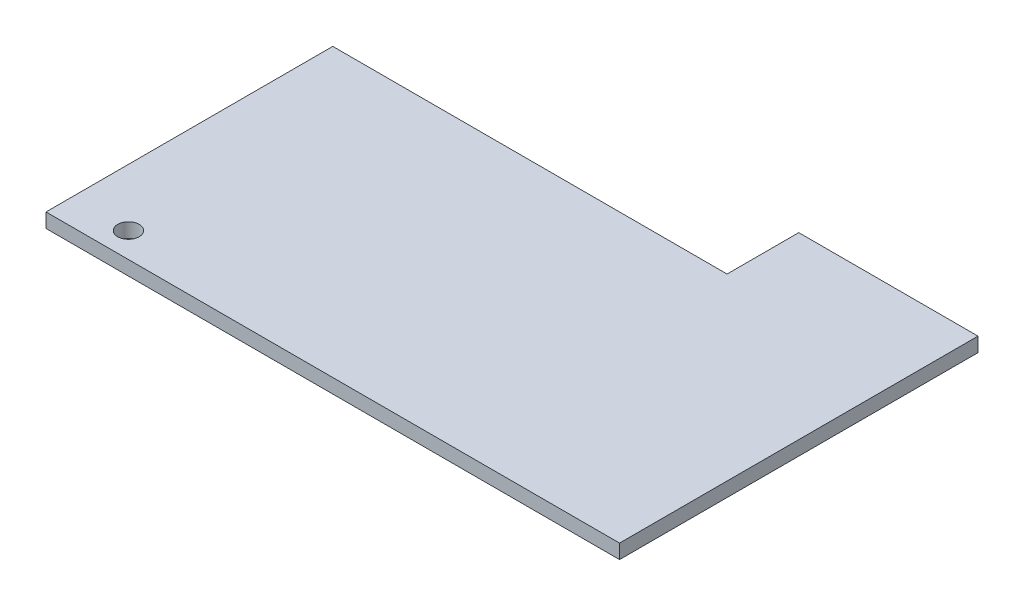
ISO-10303-21;
HEADER;
FILE_DESCRIPTION(('STEP AP214'),'2;1');
FILE_NAME('part.step','',(''),(''),'','','');
FILE_SCHEMA(('AUTOMOTIVE_DESIGN { 1 0 10303 214 1 1 1 1 }'));
ENDSEC;
DATA;
#1=APPLICATION_CONTEXT('core data for automotive mechanical design processes');
#2=APPLICATION_PROTOCOL_DEFINITION('international standard','automotive_design',2000,#1);
#3=PRODUCT_CONTEXT('',#1,'mechanical');
#4=PRODUCT('Part','Part','',(#3));
#5=PRODUCT_RELATED_PRODUCT_CATEGORY('part','',(#4));
#6=PRODUCT_DEFINITION_FORMATION('','',#4);
#7=PRODUCT_DEFINITION_CONTEXT('part definition',#1,'design');
#8=PRODUCT_DEFINITION('design','',#6,#7);
#9=PRODUCT_DEFINITION_SHAPE('','',#8);
#10=(LENGTH_UNIT() NAMED_UNIT(*) SI_UNIT(.MILLI.,.METRE.));
#11=(NAMED_UNIT(*) PLANE_ANGLE_UNIT() SI_UNIT($,.RADIAN.));
#12=(NAMED_UNIT(*) SI_UNIT($,.STERADIAN.) SOLID_ANGLE_UNIT());
#13=UNCERTAINTY_MEASURE_WITH_UNIT(LENGTH_MEASURE(1.E-05),#10,'distance_accuracy_value','');
#14=(GEOMETRIC_REPRESENTATION_CONTEXT(3) GLOBAL_UNCERTAINTY_ASSIGNED_CONTEXT((#13)) GLOBAL_UNIT_ASSIGNED_CONTEXT((#10,
#11,#12)) REPRESENTATION_CONTEXT('',''));
#15=CARTESIAN_POINT('',(0.,0.,0.));
#16=DIRECTION('',(0.,0.,1.));
#17=DIRECTION('',(1.,0.,0.));
#18=AXIS2_PLACEMENT_3D('',#15,#16,#17);
#19=CARTESIAN_POINT('',(0.,2.,0.));
#20=DIRECTION('',(1.,0.,0.));
#21=DIRECTION('',(0.,0.,-1.));
#22=AXIS2_PLACEMENT_3D('',#19,#20,#21);
#23=PLANE('',#22);
#24=DIRECTION('',(0.,0.,1.));
#25=VECTOR('',#24,1.);
#26=CARTESIAN_POINT('',(0.,2.,0.));
#27=LINE('',#26,#25);
#28=CARTESIAN_POINT('',(0.,2.,-40.));
#29=VERTEX_POINT('',#28);
#30=CARTESIAN_POINT('',(0.,2.,0.));
#31=VERTEX_POINT('',#30);
#32=EDGE_CURVE('E78',#29,#31,#27,.T.);
#33=ORIENTED_EDGE('',*,*,#32,.F.);
#34=DIRECTION('',(0.,1.,0.));
#35=VECTOR('',#34,1.);
#36=CARTESIAN_POINT('',(0.,0.,-40.));
#37=LINE('',#36,#35);
#38=CARTESIAN_POINT('',(0.,0.,-40.));
#39=VERTEX_POINT('',#38);
#40=EDGE_CURVE('E98',#39,#29,#37,.T.);
#41=ORIENTED_EDGE('',*,*,#40,.F.);
#42=DIRECTION('',(0.,0.,1.));
#43=VECTOR('',#42,1.);
#44=CARTESIAN_POINT('',(0.,0.,0.));
#45=LINE('',#44,#43);
#46=CARTESIAN_POINT('',(0.,0.,0.));
#47=VERTEX_POINT('',#46);
#48=EDGE_CURVE('E106',#39,#47,#45,.T.);
#49=ORIENTED_EDGE('',*,*,#48,.T.);
#50=DIRECTION('',(0.,-1.,0.));
#51=VECTOR('',#50,1.);
#52=CARTESIAN_POINT('',(0.,2.,0.));
#53=LINE('',#52,#51);
#54=EDGE_CURVE('E11',#31,#47,#53,.T.);
#55=ORIENTED_EDGE('',*,*,#54,.F.);
#56=EDGE_LOOP('',(#33,#41,#49,#55));
#57=FACE_BOUND('',#56,.T.);
#58=ADVANCED_FACE('F33',(#57),#23,.F.);
#59=CARTESIAN_POINT('',(0.,2.,0.));
#60=DIRECTION('',(0.,0.,-1.));
#61=DIRECTION('',(-1.,0.,0.));
#62=AXIS2_PLACEMENT_3D('',#59,#60,#61);
#63=PLANE('',#62);
#64=DIRECTION('',(1.,0.,0.));
#65=VECTOR('',#64,1.);
#66=CARTESIAN_POINT('',(0.,0.,0.));
#67=LINE('',#66,#65);
#68=CARTESIAN_POINT('',(80.,0.,0.));
#69=VERTEX_POINT('',#68);
#70=EDGE_CURVE('E111',#47,#69,#67,.T.);
#71=ORIENTED_EDGE('',*,*,#70,.T.);
#72=DIRECTION('',(0.,-1.,0.));
#73=VECTOR('',#72,1.);
#74=CARTESIAN_POINT('',(80.,2.,0.));
#75=LINE('',#74,#73);
#76=CARTESIAN_POINT('',(80.,2.,0.));
#77=VERTEX_POINT('',#76);
#78=EDGE_CURVE('E40',#77,#69,#75,.T.);
#79=ORIENTED_EDGE('',*,*,#78,.F.);
#80=DIRECTION('',(1.,0.,0.));
#81=VECTOR('',#80,1.);
#82=CARTESIAN_POINT('',(0.,2.,0.));
#83=LINE('',#82,#81);
#84=EDGE_CURVE('E137',#31,#77,#83,.T.);
#85=ORIENTED_EDGE('',*,*,#84,.F.);
#86=ORIENTED_EDGE('',*,*,#54,.T.);
#87=EDGE_LOOP('',(#71,#79,#85,#86));
#88=FACE_BOUND('',#87,.T.);
#89=ADVANCED_FACE('F161',(#88),#63,.F.);
#90=CARTESIAN_POINT('',(80.,2.,0.));
#91=DIRECTION('',(-1.,0.,0.));
#92=DIRECTION('',(0.,0.,1.));
#93=AXIS2_PLACEMENT_3D('',#90,#91,#92);
#94=PLANE('',#93);
#95=DIRECTION('',(0.,0.,-1.));
#96=VECTOR('',#95,1.);
#97=CARTESIAN_POINT('',(80.,0.,0.));
#98=LINE('',#97,#96);
#99=CARTESIAN_POINT('',(80.,0.,-50.));
#100=VERTEX_POINT('',#99);
#101=EDGE_CURVE('E73',#69,#100,#98,.T.);
#102=ORIENTED_EDGE('',*,*,#101,.T.);
#103=DIRECTION('',(0.,-1.,0.));
#104=VECTOR('',#103,1.);
#105=CARTESIAN_POINT('',(80.,2.,-50.));
#106=LINE('',#105,#104);
#107=CARTESIAN_POINT('',(80.,2.,-50.));
#108=VERTEX_POINT('',#107);
#109=EDGE_CURVE('E126',#108,#100,#106,.T.);
#110=ORIENTED_EDGE('',*,*,#109,.F.);
#111=DIRECTION('',(0.,0.,-1.));
#112=VECTOR('',#111,1.);
#113=CARTESIAN_POINT('',(80.,2.,0.));
#114=LINE('',#113,#112);
#115=EDGE_CURVE('E56',#77,#108,#114,.T.);
#116=ORIENTED_EDGE('',*,*,#115,.F.);
#117=ORIENTED_EDGE('',*,*,#78,.T.);
#118=EDGE_LOOP('',(#102,#110,#116,#117));
#119=FACE_BOUND('',#118,.T.);
#120=ADVANCED_FACE('F128',(#119),#94,.F.);
#121=CARTESIAN_POINT('',(0.,2.,-50.));
#122=DIRECTION('',(0.,0.,1.));
#123=DIRECTION('',(1.,0.,0.));
#124=AXIS2_PLACEMENT_3D('',#121,#122,#123);
#125=PLANE('',#124);
#126=DIRECTION('',(-1.,0.,0.));
#127=VECTOR('',#126,1.);
#128=CARTESIAN_POINT('',(0.,0.,-50.));
#129=LINE('',#128,#127);
#130=CARTESIAN_POINT('',(55.,0.,-50.));
#131=VERTEX_POINT('',#130);
#132=EDGE_CURVE('E123',#100,#131,#129,.T.);
#133=ORIENTED_EDGE('',*,*,#132,.T.);
#134=DIRECTION('',(0.,1.,0.));
#135=VECTOR('',#134,1.);
#136=CARTESIAN_POINT('',(55.,0.,-50.));
#137=LINE('',#136,#135);
#138=CARTESIAN_POINT('',(55.,2.,-50.));
#139=VERTEX_POINT('',#138);
#140=EDGE_CURVE('E135',#131,#139,#137,.T.);
#141=ORIENTED_EDGE('',*,*,#140,.T.);
#142=DIRECTION('',(-1.,0.,0.));
#143=VECTOR('',#142,1.);
#144=CARTESIAN_POINT('',(0.,2.,-50.));
#145=LINE('',#144,#143);
#146=EDGE_CURVE('E119',#108,#139,#145,.T.);
#147=ORIENTED_EDGE('',*,*,#146,.F.);
#148=ORIENTED_EDGE('',*,*,#109,.T.);
#149=EDGE_LOOP('',(#133,#141,#147,#148));
#150=FACE_BOUND('',#149,.T.);
#151=ADVANCED_FACE('F133',(#150),#125,.F.);
#152=CARTESIAN_POINT('',(0.,2.,0.));
#153=DIRECTION('',(0.,-1.,0.));
#154=DIRECTION('',(0.,0.,-1.));
#155=AXIS2_PLACEMENT_3D('',#152,#153,#154);
#156=PLANE('',#155);
#157=CARTESIAN_POINT('',(8.,2.,-3.5));
#158=DIRECTION('',(0.,1.,0.));
#159=DIRECTION('',(0.,0.,1.));
#160=AXIS2_PLACEMENT_3D('',#157,#158,#159);
#161=CIRCLE('',#160,1.5);
#162=CARTESIAN_POINT('',(8.,2.,-2.));
#163=VERTEX_POINT('',#162);
#164=EDGE_CURVE('E116',#163,#163,#161,.T.);
#165=ORIENTED_EDGE('',*,*,#164,.F.);
#166=EDGE_LOOP('',(#165));
#167=FACE_BOUND('',#166,.T.);
#168=ORIENTED_EDGE('',*,*,#146,.T.);
#169=DIRECTION('',(0.,0.,-1.));
#170=VECTOR('',#169,1.);
#171=CARTESIAN_POINT('',(55.,2.,-50.));
#172=LINE('',#171,#170);
#173=CARTESIAN_POINT('',(55.,2.,-40.));
#174=VERTEX_POINT('',#173);
#175=EDGE_CURVE('E102',#174,#139,#172,.T.);
#176=ORIENTED_EDGE('',*,*,#175,.F.);
#177=DIRECTION('',(1.,0.,0.));
#178=VECTOR('',#177,1.);
#179=CARTESIAN_POINT('',(0.,2.,-40.));
#180=LINE('',#179,#178);
#181=EDGE_CURVE('E146',#29,#174,#180,.T.);
#182=ORIENTED_EDGE('',*,*,#181,.F.);
#183=ORIENTED_EDGE('',*,*,#32,.T.);
#184=ORIENTED_EDGE('',*,*,#84,.T.);
#185=ORIENTED_EDGE('',*,*,#115,.T.);
#186=EDGE_LOOP('',(#168,#176,#182,#183,#184,#185));
#187=FACE_BOUND('',#186,.T.);
#188=ADVANCED_FACE('F148',(#167,#187),#156,.F.);
#189=CARTESIAN_POINT('',(0.,0.,0.));
#190=DIRECTION('',(0.,-1.,0.));
#191=DIRECTION('',(0.,0.,-1.));
#192=AXIS2_PLACEMENT_3D('',#189,#190,#191);
#193=PLANE('',#192);
#194=DIRECTION('',(0.,0.,-1.));
#195=VECTOR('',#194,1.);
#196=CARTESIAN_POINT('',(55.,0.,-50.));
#197=LINE('',#196,#195);
#198=CARTESIAN_POINT('',(55.,0.,-40.));
#199=VERTEX_POINT('',#198);
#200=EDGE_CURVE('E47',#199,#131,#197,.T.);
#201=ORIENTED_EDGE('',*,*,#200,.T.);
#202=ORIENTED_EDGE('',*,*,#132,.F.);
#203=ORIENTED_EDGE('',*,*,#101,.F.);
#204=ORIENTED_EDGE('',*,*,#70,.F.);
#205=ORIENTED_EDGE('',*,*,#48,.F.);
#206=DIRECTION('',(1.,0.,0.));
#207=VECTOR('',#206,1.);
#208=CARTESIAN_POINT('',(0.,0.,-40.));
#209=LINE('',#208,#207);
#210=EDGE_CURVE('E94',#39,#199,#209,.T.);
#211=ORIENTED_EDGE('',*,*,#210,.T.);
#212=EDGE_LOOP('',(#201,#202,#203,#204,#205,#211));
#213=FACE_BOUND('',#212,.T.);
#214=CARTESIAN_POINT('',(8.,0.,-3.5));
#215=DIRECTION('',(0.,1.,0.));
#216=DIRECTION('',(0.,0.,1.));
#217=AXIS2_PLACEMENT_3D('',#214,#215,#216);
#218=CIRCLE('',#217,1.5);
#219=CARTESIAN_POINT('',(8.,0.,-2.));
#220=VERTEX_POINT('',#219);
#221=EDGE_CURVE('E112',#220,#220,#218,.T.);
#222=ORIENTED_EDGE('',*,*,#221,.T.);
#223=EDGE_LOOP('',(#222));
#224=FACE_BOUND('',#223,.T.);
#225=ADVANCED_FACE('F109',(#213,#224),#193,.T.);
#226=CARTESIAN_POINT('',(8.,0.,-3.5));
#227=DIRECTION('',(0.,1.,0.));
#228=DIRECTION('',(0.,0.,1.));
#229=AXIS2_PLACEMENT_3D('',#226,#227,#228);
#230=CYLINDRICAL_SURFACE('',#229,1.5);
#231=ORIENTED_EDGE('',*,*,#221,.F.);
#232=EDGE_LOOP('',(#231));
#233=FACE_BOUND('',#232,.T.);
#234=ORIENTED_EDGE('',*,*,#164,.T.);
#235=EDGE_LOOP('',(#234));
#236=FACE_BOUND('',#235,.T.);
#237=ADVANCED_FACE('F151',(#233,#236),#230,.F.);
#238=CARTESIAN_POINT('',(55.,0.,-50.));
#239=DIRECTION('',(1.,0.,0.));
#240=DIRECTION('',(0.,0.,-1.));
#241=AXIS2_PLACEMENT_3D('',#238,#239,#240);
#242=PLANE('',#241);
#243=ORIENTED_EDGE('',*,*,#175,.T.);
#244=ORIENTED_EDGE('',*,*,#140,.F.);
#245=ORIENTED_EDGE('',*,*,#200,.F.);
#246=DIRECTION('',(0.,1.,0.));
#247=VECTOR('',#246,1.);
#248=CARTESIAN_POINT('',(55.,0.,-40.));
#249=LINE('',#248,#247);
#250=EDGE_CURVE('E99',#199,#174,#249,.T.);
#251=ORIENTED_EDGE('',*,*,#250,.T.);
#252=EDGE_LOOP('',(#243,#244,#245,#251));
#253=FACE_BOUND('',#252,.T.);
#254=ADVANCED_FACE('F149',(#253),#242,.F.);
#255=CARTESIAN_POINT('',(0.,0.,-40.));
#256=DIRECTION('',(0.,0.,1.));
#257=DIRECTION('',(1.,0.,0.));
#258=AXIS2_PLACEMENT_3D('',#255,#256,#257);
#259=PLANE('',#258);
#260=ORIENTED_EDGE('',*,*,#181,.T.);
#261=ORIENTED_EDGE('',*,*,#250,.F.);
#262=ORIENTED_EDGE('',*,*,#210,.F.);
#263=ORIENTED_EDGE('',*,*,#40,.T.);
#264=EDGE_LOOP('',(#260,#261,#262,#263));
#265=FACE_BOUND('',#264,.T.);
#266=ADVANCED_FACE('F97',(#265),#259,.F.);
#267=CLOSED_SHELL('',(#58,#89,#120,#151,#188,#225,#237,#254,#266));
#268=MANIFOLD_SOLID_BREP('B2',#267);
#269=ADVANCED_BREP_SHAPE_REPRESENTATION('',(#18,#268),#14);
#270=SHAPE_DEFINITION_REPRESENTATION(#9,#269);
ENDSEC;
END-ISO-10303-21;
